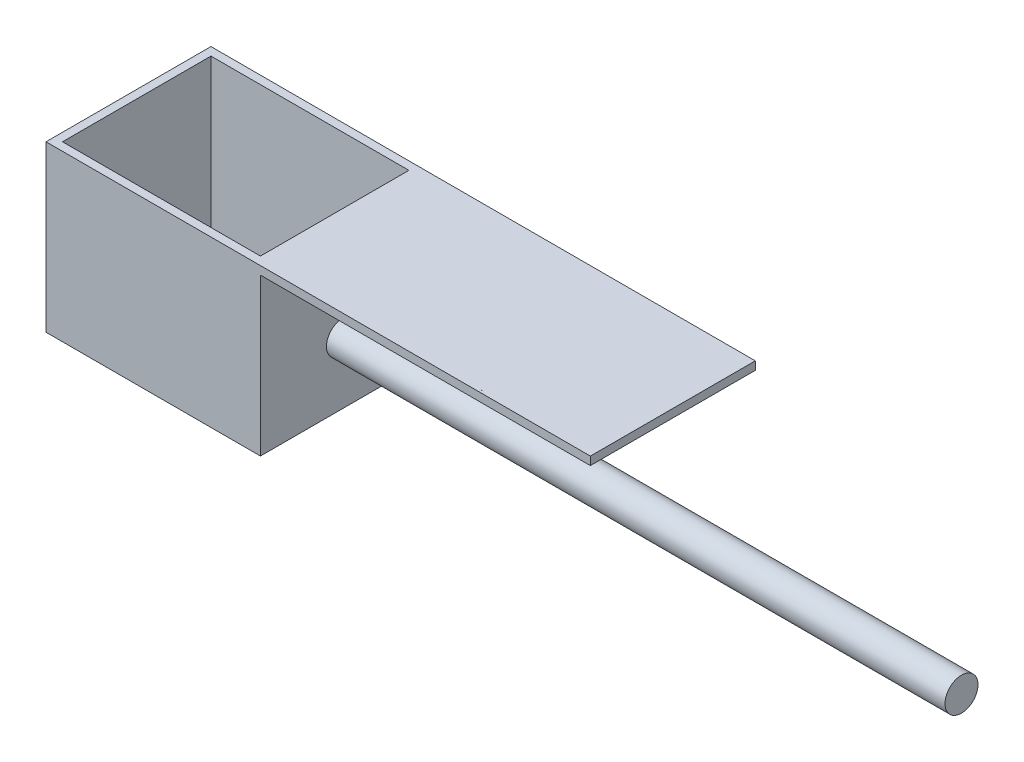
ISO-10303-21;
HEADER;
FILE_DESCRIPTION(('STEP AP214'),'2;1');
FILE_NAME('part.step','',(''),(''),'','','');
FILE_SCHEMA(('AUTOMOTIVE_DESIGN { 1 0 10303 214 1 1 1 1 }'));
ENDSEC;
DATA;
#1=APPLICATION_CONTEXT('core data for automotive mechanical design processes');
#2=APPLICATION_PROTOCOL_DEFINITION('international standard','automotive_design',2000,#1);
#3=PRODUCT_CONTEXT('',#1,'mechanical');
#4=PRODUCT('Part','Part','',(#3));
#5=PRODUCT_RELATED_PRODUCT_CATEGORY('part','',(#4));
#6=PRODUCT_DEFINITION_FORMATION('','',#4);
#7=PRODUCT_DEFINITION_CONTEXT('part definition',#1,'design');
#8=PRODUCT_DEFINITION('design','',#6,#7);
#9=PRODUCT_DEFINITION_SHAPE('','',#8);
#10=(LENGTH_UNIT() NAMED_UNIT(*) SI_UNIT(.MILLI.,.METRE.));
#11=(NAMED_UNIT(*) PLANE_ANGLE_UNIT() SI_UNIT($,.RADIAN.));
#12=(NAMED_UNIT(*) SI_UNIT($,.STERADIAN.) SOLID_ANGLE_UNIT());
#13=UNCERTAINTY_MEASURE_WITH_UNIT(LENGTH_MEASURE(1.E-05),#10,'distance_accuracy_value','');
#14=(GEOMETRIC_REPRESENTATION_CONTEXT(3) GLOBAL_UNCERTAINTY_ASSIGNED_CONTEXT((#13)) GLOBAL_UNIT_ASSIGNED_CONTEXT((#10,
#11,#12)) REPRESENTATION_CONTEXT('',''));
#15=CARTESIAN_POINT('',(0.,0.,0.));
#16=DIRECTION('',(0.,0.,1.));
#17=DIRECTION('',(1.,0.,0.));
#18=AXIS2_PLACEMENT_3D('',#15,#16,#17);
#19=CARTESIAN_POINT('',(52.,40.,0.));
#20=DIRECTION('',(-1.,0.,0.));
#21=DIRECTION('',(0.,0.,1.));
#22=AXIS2_PLACEMENT_3D('',#19,#20,#21);
#23=PLANE('',#22);
#24=CARTESIAN_POINT('',(52.,15.,20.));
#25=DIRECTION('',(-1.,0.,0.));
#26=DIRECTION('',(0.,0.,1.));
#27=AXIS2_PLACEMENT_3D('',#24,#25,#26);
#28=CIRCLE('',#27,4.);
#29=CARTESIAN_POINT('',(52.,15.,24.));
#30=VERTEX_POINT('',#29);
#31=EDGE_CURVE('E11',#30,#30,#28,.F.);
#32=ORIENTED_EDGE('',*,*,#31,.F.);
#33=EDGE_LOOP('',(#32));
#34=FACE_BOUND('',#33,.T.);
#35=DIRECTION('',(0.,0.,-1.));
#36=VECTOR('',#35,1.);
#37=CARTESIAN_POINT('',(52.,38.,40.));
#38=LINE('',#37,#36);
#39=CARTESIAN_POINT('',(52.,38.,40.));
#40=VERTEX_POINT('',#39);
#41=CARTESIAN_POINT('',(52.,38.,0.));
#42=VERTEX_POINT('',#41);
#43=EDGE_CURVE('E48',#40,#42,#38,.T.);
#44=ORIENTED_EDGE('',*,*,#43,.F.);
#45=DIRECTION('',(0.,-1.,0.));
#46=VECTOR('',#45,1.);
#47=CARTESIAN_POINT('',(52.,40.,40.));
#48=LINE('',#47,#46);
#49=CARTESIAN_POINT('',(52.,0.,40.));
#50=VERTEX_POINT('',#49);
#51=EDGE_CURVE('E132',#40,#50,#48,.T.);
#52=ORIENTED_EDGE('',*,*,#51,.T.);
#53=DIRECTION('',(0.,0.,-1.));
#54=VECTOR('',#53,1.);
#55=CARTESIAN_POINT('',(52.,0.,0.));
#56=LINE('',#55,#54);
#57=CARTESIAN_POINT('',(52.,0.,0.));
#58=VERTEX_POINT('',#57);
#59=EDGE_CURVE('E180',#50,#58,#56,.T.);
#60=ORIENTED_EDGE('',*,*,#59,.T.);
#61=DIRECTION('',(0.,-1.,0.));
#62=VECTOR('',#61,1.);
#63=CARTESIAN_POINT('',(52.,40.,0.));
#64=LINE('',#63,#62);
#65=EDGE_CURVE('E186',#42,#58,#64,.T.);
#66=ORIENTED_EDGE('',*,*,#65,.F.);
#67=EDGE_LOOP('',(#44,#52,#60,#66));
#68=FACE_BOUND('',#67,.T.);
#69=ADVANCED_FACE('F33',(#34,#68),#23,.F.);
#70=CARTESIAN_POINT('',(0.,40.,0.));
#71=DIRECTION('',(0.,1.,0.));
#72=DIRECTION('',(0.,0.,1.));
#73=AXIS2_PLACEMENT_3D('',#70,#71,#72);
#74=PLANE('',#73);
#75=DIRECTION('',(0.,0.,1.));
#76=VECTOR('',#75,1.);
#77=CARTESIAN_POINT('',(0.,40.,0.));
#78=LINE('',#77,#76);
#79=CARTESIAN_POINT('',(0.,40.,0.));
#80=VERTEX_POINT('',#79);
#81=CARTESIAN_POINT('',(0.,40.,40.));
#82=VERTEX_POINT('',#81);
#83=EDGE_CURVE('E167',#80,#82,#78,.T.);
#84=ORIENTED_EDGE('',*,*,#83,.T.);
#85=DIRECTION('',(1.,0.,0.));
#86=VECTOR('',#85,1.);
#87=CARTESIAN_POINT('',(0.,40.,40.));
#88=LINE('',#87,#86);
#89=CARTESIAN_POINT('',(132.,40.,40.));
#90=VERTEX_POINT('',#89);
#91=EDGE_CURVE('E170',#82,#90,#88,.T.);
#92=ORIENTED_EDGE('',*,*,#91,.T.);
#93=DIRECTION('',(0.,0.,1.));
#94=VECTOR('',#93,1.);
#95=CARTESIAN_POINT('',(132.,40.,40.));
#96=LINE('',#95,#94);
#97=CARTESIAN_POINT('',(132.,40.,0.));
#98=VERTEX_POINT('',#97);
#99=EDGE_CURVE('E127',#98,#90,#96,.T.);
#100=ORIENTED_EDGE('',*,*,#99,.F.);
#101=DIRECTION('',(-1.,0.,0.));
#102=VECTOR('',#101,1.);
#103=CARTESIAN_POINT('',(0.,40.,0.));
#104=LINE('',#103,#102);
#105=EDGE_CURVE('E173',#98,#80,#104,.T.);
#106=ORIENTED_EDGE('',*,*,#105,.T.);
#107=EDGE_LOOP('',(#84,#92,#100,#106));
#108=FACE_BOUND('',#107,.T.);
#109=DIRECTION('',(1.,0.,0.));
#110=VECTOR('',#109,1.);
#111=CARTESIAN_POINT('',(2.,40.,38.));
#112=LINE('',#111,#110);
#113=CARTESIAN_POINT('',(2.,40.,38.));
#114=VERTEX_POINT('',#113);
#115=CARTESIAN_POINT('',(50.,40.,38.));
#116=VERTEX_POINT('',#115);
#117=EDGE_CURVE('E143',#114,#116,#112,.T.);
#118=ORIENTED_EDGE('',*,*,#117,.F.);
#119=DIRECTION('',(0.,0.,1.));
#120=VECTOR('',#119,1.);
#121=CARTESIAN_POINT('',(2.,40.,2.));
#122=LINE('',#121,#120);
#123=CARTESIAN_POINT('',(2.,40.,2.));
#124=VERTEX_POINT('',#123);
#125=EDGE_CURVE('E141',#124,#114,#122,.T.);
#126=ORIENTED_EDGE('',*,*,#125,.F.);
#127=DIRECTION('',(-1.,0.,0.));
#128=VECTOR('',#127,1.);
#129=CARTESIAN_POINT('',(2.,40.,2.));
#130=LINE('',#129,#128);
#131=CARTESIAN_POINT('',(50.,40.,2.));
#132=VERTEX_POINT('',#131);
#133=EDGE_CURVE('E148',#132,#124,#130,.T.);
#134=ORIENTED_EDGE('',*,*,#133,.F.);
#135=DIRECTION('',(0.,0.,-1.));
#136=VECTOR('',#135,1.);
#137=CARTESIAN_POINT('',(50.,40.,2.));
#138=LINE('',#137,#136);
#139=EDGE_CURVE('E146',#116,#132,#138,.T.);
#140=ORIENTED_EDGE('',*,*,#139,.F.);
#141=EDGE_LOOP('',(#118,#126,#134,#140));
#142=FACE_BOUND('',#141,.T.);
#143=ADVANCED_FACE('F217',(#108,#142),#74,.T.);
#144=CARTESIAN_POINT('',(0.,0.,0.));
#145=DIRECTION('',(0.,1.,0.));
#146=DIRECTION('',(0.,0.,1.));
#147=AXIS2_PLACEMENT_3D('',#144,#145,#146);
#148=PLANE('',#147);
#149=DIRECTION('',(0.,0.,1.));
#150=VECTOR('',#149,1.);
#151=CARTESIAN_POINT('',(0.,0.,0.));
#152=LINE('',#151,#150);
#153=CARTESIAN_POINT('',(0.,0.,0.));
#154=VERTEX_POINT('',#153);
#155=CARTESIAN_POINT('',(0.,0.,40.));
#156=VERTEX_POINT('',#155);
#157=EDGE_CURVE('E166',#154,#156,#152,.T.);
#158=ORIENTED_EDGE('',*,*,#157,.F.);
#159=DIRECTION('',(-1.,0.,0.));
#160=VECTOR('',#159,1.);
#161=CARTESIAN_POINT('',(0.,0.,0.));
#162=LINE('',#161,#160);
#163=EDGE_CURVE('E171',#58,#154,#162,.T.);
#164=ORIENTED_EDGE('',*,*,#163,.F.);
#165=ORIENTED_EDGE('',*,*,#59,.F.);
#166=DIRECTION('',(1.,0.,0.));
#167=VECTOR('',#166,1.);
#168=CARTESIAN_POINT('',(0.,0.,40.));
#169=LINE('',#168,#167);
#170=EDGE_CURVE('E178',#156,#50,#169,.T.);
#171=ORIENTED_EDGE('',*,*,#170,.F.);
#172=EDGE_LOOP('',(#158,#164,#165,#171));
#173=FACE_BOUND('',#172,.T.);
#174=DIRECTION('',(0.,0.,1.));
#175=VECTOR('',#174,1.);
#176=CARTESIAN_POINT('',(2.,0.,2.));
#177=LINE('',#176,#175);
#178=CARTESIAN_POINT('',(2.,0.,2.));
#179=VERTEX_POINT('',#178);
#180=CARTESIAN_POINT('',(2.,0.,38.));
#181=VERTEX_POINT('',#180);
#182=EDGE_CURVE('E133',#179,#181,#177,.T.);
#183=ORIENTED_EDGE('',*,*,#182,.T.);
#184=DIRECTION('',(1.,0.,0.));
#185=VECTOR('',#184,1.);
#186=CARTESIAN_POINT('',(2.,0.,38.));
#187=LINE('',#186,#185);
#188=CARTESIAN_POINT('',(50.,0.,38.));
#189=VERTEX_POINT('',#188);
#190=EDGE_CURVE('E136',#181,#189,#187,.T.);
#191=ORIENTED_EDGE('',*,*,#190,.T.);
#192=DIRECTION('',(0.,0.,-1.));
#193=VECTOR('',#192,1.);
#194=CARTESIAN_POINT('',(50.,0.,2.));
#195=LINE('',#194,#193);
#196=CARTESIAN_POINT('',(50.,0.,2.));
#197=VERTEX_POINT('',#196);
#198=EDGE_CURVE('E153',#189,#197,#195,.T.);
#199=ORIENTED_EDGE('',*,*,#198,.T.);
#200=DIRECTION('',(-1.,0.,0.));
#201=VECTOR('',#200,1.);
#202=CARTESIAN_POINT('',(2.,0.,2.));
#203=LINE('',#202,#201);
#204=EDGE_CURVE('E144',#197,#179,#203,.T.);
#205=ORIENTED_EDGE('',*,*,#204,.T.);
#206=EDGE_LOOP('',(#183,#191,#199,#205));
#207=FACE_BOUND('',#206,.T.);
#208=ADVANCED_FACE('F197',(#173,#207),#148,.F.);
#209=CARTESIAN_POINT('',(0.,40.,0.));
#210=DIRECTION('',(1.,0.,0.));
#211=DIRECTION('',(0.,0.,-1.));
#212=AXIS2_PLACEMENT_3D('',#209,#210,#211);
#213=PLANE('',#212);
#214=ORIENTED_EDGE('',*,*,#157,.T.);
#215=DIRECTION('',(0.,-1.,0.));
#216=VECTOR('',#215,1.);
#217=CARTESIAN_POINT('',(0.,40.,40.));
#218=LINE('',#217,#216);
#219=EDGE_CURVE('E41',#82,#156,#218,.T.);
#220=ORIENTED_EDGE('',*,*,#219,.F.);
#221=ORIENTED_EDGE('',*,*,#83,.F.);
#222=DIRECTION('',(0.,-1.,0.));
#223=VECTOR('',#222,1.);
#224=CARTESIAN_POINT('',(0.,40.,0.));
#225=LINE('',#224,#223);
#226=EDGE_CURVE('E175',#80,#154,#225,.T.);
#227=ORIENTED_EDGE('',*,*,#226,.T.);
#228=EDGE_LOOP('',(#214,#220,#221,#227));
#229=FACE_BOUND('',#228,.T.);
#230=ADVANCED_FACE('F35',(#229),#213,.F.);
#231=CARTESIAN_POINT('',(0.,40.,40.));
#232=DIRECTION('',(0.,0.,-1.));
#233=DIRECTION('',(-1.,0.,0.));
#234=AXIS2_PLACEMENT_3D('',#231,#232,#233);
#235=PLANE('',#234);
#236=ORIENTED_EDGE('',*,*,#170,.T.);
#237=ORIENTED_EDGE('',*,*,#51,.F.);
#238=DIRECTION('',(-1.,0.,0.));
#239=VECTOR('',#238,1.);
#240=CARTESIAN_POINT('',(132.,38.,40.));
#241=LINE('',#240,#239);
#242=CARTESIAN_POINT('',(132.,38.,40.));
#243=VERTEX_POINT('',#242);
#244=EDGE_CURVE('E114',#243,#40,#241,.T.);
#245=ORIENTED_EDGE('',*,*,#244,.F.);
#246=DIRECTION('',(0.,-1.,0.));
#247=VECTOR('',#246,1.);
#248=CARTESIAN_POINT('',(132.,40.,40.));
#249=LINE('',#248,#247);
#250=EDGE_CURVE('E121',#90,#243,#249,.T.);
#251=ORIENTED_EDGE('',*,*,#250,.F.);
#252=ORIENTED_EDGE('',*,*,#91,.F.);
#253=ORIENTED_EDGE('',*,*,#219,.T.);
#254=EDGE_LOOP('',(#236,#237,#245,#251,#252,#253));
#255=FACE_BOUND('',#254,.T.);
#256=ADVANCED_FACE('F131',(#255),#235,.F.);
#257=CARTESIAN_POINT('',(0.,40.,0.));
#258=DIRECTION('',(0.,0.,1.));
#259=DIRECTION('',(1.,0.,0.));
#260=AXIS2_PLACEMENT_3D('',#257,#258,#259);
#261=PLANE('',#260);
#262=ORIENTED_EDGE('',*,*,#163,.T.);
#263=ORIENTED_EDGE('',*,*,#226,.F.);
#264=ORIENTED_EDGE('',*,*,#105,.F.);
#265=DIRECTION('',(0.,1.,0.));
#266=VECTOR('',#265,1.);
#267=CARTESIAN_POINT('',(132.,40.,0.));
#268=LINE('',#267,#266);
#269=CARTESIAN_POINT('',(132.,38.,0.));
#270=VERTEX_POINT('',#269);
#271=EDGE_CURVE('E120',#270,#98,#268,.T.);
#272=ORIENTED_EDGE('',*,*,#271,.F.);
#273=DIRECTION('',(-1.,0.,0.));
#274=VECTOR('',#273,1.);
#275=CARTESIAN_POINT('',(132.,38.,0.));
#276=LINE('',#275,#274);
#277=EDGE_CURVE('E116',#270,#42,#276,.T.);
#278=ORIENTED_EDGE('',*,*,#277,.T.);
#279=ORIENTED_EDGE('',*,*,#65,.T.);
#280=EDGE_LOOP('',(#262,#263,#264,#272,#278,#279));
#281=FACE_BOUND('',#280,.T.);
#282=ADVANCED_FACE('F201',(#281),#261,.F.);
#283=CARTESIAN_POINT('',(2.,40.,2.));
#284=DIRECTION('',(1.,0.,0.));
#285=DIRECTION('',(0.,0.,-1.));
#286=AXIS2_PLACEMENT_3D('',#283,#284,#285);
#287=PLANE('',#286);
#288=ORIENTED_EDGE('',*,*,#182,.F.);
#289=DIRECTION('',(0.,-1.,0.));
#290=VECTOR('',#289,1.);
#291=CARTESIAN_POINT('',(2.,40.,2.));
#292=LINE('',#291,#290);
#293=EDGE_CURVE('E149',#124,#179,#292,.T.);
#294=ORIENTED_EDGE('',*,*,#293,.F.);
#295=ORIENTED_EDGE('',*,*,#125,.T.);
#296=DIRECTION('',(0.,-1.,0.));
#297=VECTOR('',#296,1.);
#298=CARTESIAN_POINT('',(2.,40.,38.));
#299=LINE('',#298,#297);
#300=EDGE_CURVE('E163',#114,#181,#299,.T.);
#301=ORIENTED_EDGE('',*,*,#300,.T.);
#302=EDGE_LOOP('',(#288,#294,#295,#301));
#303=FACE_BOUND('',#302,.T.);
#304=ADVANCED_FACE('F233',(#303),#287,.T.);
#305=CARTESIAN_POINT('',(2.,40.,38.));
#306=DIRECTION('',(0.,0.,-1.));
#307=DIRECTION('',(-1.,0.,0.));
#308=AXIS2_PLACEMENT_3D('',#305,#306,#307);
#309=PLANE('',#308);
#310=ORIENTED_EDGE('',*,*,#190,.F.);
#311=ORIENTED_EDGE('',*,*,#300,.F.);
#312=ORIENTED_EDGE('',*,*,#117,.T.);
#313=DIRECTION('',(0.,-1.,0.));
#314=VECTOR('',#313,1.);
#315=CARTESIAN_POINT('',(50.,40.,38.));
#316=LINE('',#315,#314);
#317=EDGE_CURVE('E161',#116,#189,#316,.T.);
#318=ORIENTED_EDGE('',*,*,#317,.T.);
#319=EDGE_LOOP('',(#310,#311,#312,#318));
#320=FACE_BOUND('',#319,.T.);
#321=ADVANCED_FACE('F242',(#320),#309,.T.);
#322=CARTESIAN_POINT('',(50.,40.,2.));
#323=DIRECTION('',(-1.,0.,0.));
#324=DIRECTION('',(0.,0.,1.));
#325=AXIS2_PLACEMENT_3D('',#322,#323,#324);
#326=PLANE('',#325);
#327=ORIENTED_EDGE('',*,*,#198,.F.);
#328=ORIENTED_EDGE('',*,*,#317,.F.);
#329=ORIENTED_EDGE('',*,*,#139,.T.);
#330=DIRECTION('',(0.,-1.,0.));
#331=VECTOR('',#330,1.);
#332=CARTESIAN_POINT('',(50.,40.,2.));
#333=LINE('',#332,#331);
#334=EDGE_CURVE('E56',#132,#197,#333,.T.);
#335=ORIENTED_EDGE('',*,*,#334,.T.);
#336=EDGE_LOOP('',(#327,#328,#329,#335));
#337=FACE_BOUND('',#336,.T.);
#338=ADVANCED_FACE('F246',(#337),#326,.T.);
#339=CARTESIAN_POINT('',(2.,40.,2.));
#340=DIRECTION('',(0.,0.,1.));
#341=DIRECTION('',(1.,0.,0.));
#342=AXIS2_PLACEMENT_3D('',#339,#340,#341);
#343=PLANE('',#342);
#344=ORIENTED_EDGE('',*,*,#204,.F.);
#345=ORIENTED_EDGE('',*,*,#334,.F.);
#346=ORIENTED_EDGE('',*,*,#133,.T.);
#347=ORIENTED_EDGE('',*,*,#293,.T.);
#348=EDGE_LOOP('',(#344,#345,#346,#347));
#349=FACE_BOUND('',#348,.T.);
#350=ADVANCED_FACE('F250',(#349),#343,.T.);
#351=CARTESIAN_POINT('',(132.,38.,40.));
#352=DIRECTION('',(0.,1.,0.));
#353=DIRECTION('',(0.,0.,1.));
#354=AXIS2_PLACEMENT_3D('',#351,#352,#353);
#355=PLANE('',#354);
#356=ORIENTED_EDGE('',*,*,#43,.T.);
#357=ORIENTED_EDGE('',*,*,#277,.F.);
#358=DIRECTION('',(0.,0.,-1.));
#359=VECTOR('',#358,1.);
#360=CARTESIAN_POINT('',(132.,38.,40.));
#361=LINE('',#360,#359);
#362=EDGE_CURVE('E110',#243,#270,#361,.T.);
#363=ORIENTED_EDGE('',*,*,#362,.F.);
#364=ORIENTED_EDGE('',*,*,#244,.T.);
#365=EDGE_LOOP('',(#356,#357,#363,#364));
#366=FACE_BOUND('',#365,.T.);
#367=ADVANCED_FACE('F112',(#366),#355,.F.);
#368=CARTESIAN_POINT('',(132.,0.,0.));
#369=DIRECTION('',(1.,0.,0.));
#370=DIRECTION('',(0.,0.,-1.));
#371=AXIS2_PLACEMENT_3D('',#368,#369,#370);
#372=PLANE('',#371);
#373=ORIENTED_EDGE('',*,*,#250,.T.);
#374=ORIENTED_EDGE('',*,*,#362,.T.);
#375=ORIENTED_EDGE('',*,*,#271,.T.);
#376=ORIENTED_EDGE('',*,*,#99,.T.);
#377=EDGE_LOOP('',(#373,#374,#375,#376));
#378=FACE_BOUND('',#377,.T.);
#379=ADVANCED_FACE('F125',(#378),#372,.T.);
#380=CARTESIAN_POINT('',(202.,15.,20.));
#381=DIRECTION('',(-1.,0.,0.));
#382=DIRECTION('',(0.,0.,1.));
#383=AXIS2_PLACEMENT_3D('',#380,#381,#382);
#384=CYLINDRICAL_SURFACE('',#383,4.);
#385=CARTESIAN_POINT('',(202.,15.,20.));
#386=DIRECTION('',(1.,0.,0.));
#387=DIRECTION('',(0.,0.,-1.));
#388=AXIS2_PLACEMENT_3D('',#385,#386,#387);
#389=CIRCLE('',#388,4.);
#390=CARTESIAN_POINT('',(202.,15.,16.));
#391=VERTEX_POINT('',#390);
#392=EDGE_CURVE('E200',#391,#391,#389,.T.);
#393=ORIENTED_EDGE('',*,*,#392,.F.);
#394=EDGE_LOOP('',(#393));
#395=FACE_BOUND('',#394,.T.);
#396=ORIENTED_EDGE('',*,*,#31,.T.);
#397=EDGE_LOOP('',(#396));
#398=FACE_BOUND('',#397,.T.);
#399=ADVANCED_FACE('F210',(#395,#398),#384,.T.);
#400=CARTESIAN_POINT('',(202.,15.,20.));
#401=DIRECTION('',(1.,0.,0.));
#402=DIRECTION('',(0.,0.,-1.));
#403=AXIS2_PLACEMENT_3D('',#400,#401,#402);
#404=PLANE('',#403);
#405=ORIENTED_EDGE('',*,*,#392,.T.);
#406=EDGE_LOOP('',(#405));
#407=FACE_BOUND('',#406,.T.);
#408=ADVANCED_FACE('F208',(#407),#404,.T.);
#409=CLOSED_SHELL('',(#69,#143,#208,#230,#256,#282,#304,#321,#338,#350,#367,#379,#399,#408));
#410=MANIFOLD_SOLID_BREP('B2',#409);
#411=ADVANCED_BREP_SHAPE_REPRESENTATION('',(#18,#410),#14);
#412=SHAPE_DEFINITION_REPRESENTATION(#9,#411);
ENDSEC;
END-ISO-10303-21;
